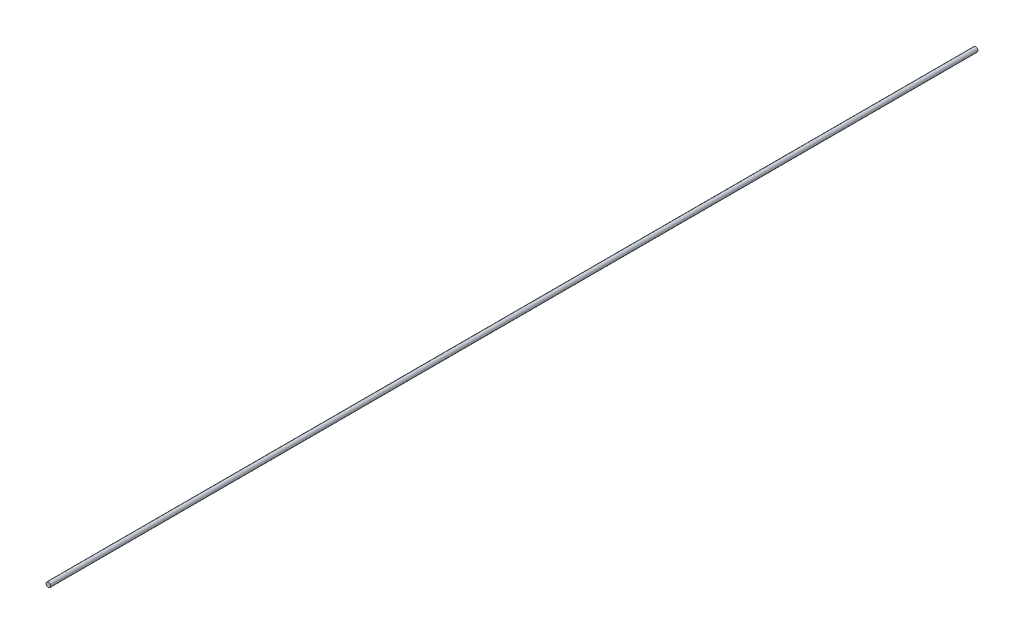
ISO-10303-21;
HEADER;
FILE_DESCRIPTION(('STEP AP214'),'2;1');
FILE_NAME('part.step','',(''),(''),'','','');
FILE_SCHEMA(('AUTOMOTIVE_DESIGN { 1 0 10303 214 1 1 1 1 }'));
ENDSEC;
DATA;
#1=APPLICATION_CONTEXT('core data for automotive mechanical design processes');
#2=APPLICATION_PROTOCOL_DEFINITION('international standard','automotive_design',2000,#1);
#3=PRODUCT_CONTEXT('',#1,'mechanical');
#4=PRODUCT('Part','Part','',(#3));
#5=PRODUCT_RELATED_PRODUCT_CATEGORY('part','',(#4));
#6=PRODUCT_DEFINITION_FORMATION('','',#4);
#7=PRODUCT_DEFINITION_CONTEXT('part definition',#1,'design');
#8=PRODUCT_DEFINITION('design','',#6,#7);
#9=PRODUCT_DEFINITION_SHAPE('','',#8);
#10=(LENGTH_UNIT() NAMED_UNIT(*) SI_UNIT(.MILLI.,.METRE.));
#11=(NAMED_UNIT(*) PLANE_ANGLE_UNIT() SI_UNIT($,.RADIAN.));
#12=(NAMED_UNIT(*) SI_UNIT($,.STERADIAN.) SOLID_ANGLE_UNIT());
#13=UNCERTAINTY_MEASURE_WITH_UNIT(LENGTH_MEASURE(1.E-05),#10,'distance_accuracy_value','');
#14=(GEOMETRIC_REPRESENTATION_CONTEXT(3) GLOBAL_UNCERTAINTY_ASSIGNED_CONTEXT((#13)) GLOBAL_UNIT_ASSIGNED_CONTEXT((#10,
#11,#12)) REPRESENTATION_CONTEXT('',''));
#15=CARTESIAN_POINT('',(0.,0.,0.));
#16=DIRECTION('',(0.,0.,1.));
#17=DIRECTION('',(1.,0.,0.));
#18=AXIS2_PLACEMENT_3D('',#15,#16,#17);
#19=CARTESIAN_POINT('',(0.,0.,1270.));
#20=DIRECTION('',(0.,0.,-1.));
#21=DIRECTION('',(-1.,0.,0.));
#22=AXIS2_PLACEMENT_3D('',#19,#20,#21);
#23=CYLINDRICAL_SURFACE('',#22,3.175);
#24=CARTESIAN_POINT('',(0.,0.,1270.));
#25=DIRECTION('',(0.,0.,1.));
#26=DIRECTION('',(1.,0.,0.));
#27=AXIS2_PLACEMENT_3D('',#24,#25,#26);
#28=CIRCLE('',#27,3.175);
#29=CARTESIAN_POINT('',(-3.175,0.,1270.));
#30=VERTEX_POINT('',#29);
#31=EDGE_CURVE('E10',#30,#30,#28,.T.);
#32=CARTESIAN_POINT('',(0.,0.,0.));
#33=DIRECTION('',(0.,0.,1.));
#34=DIRECTION('',(1.,0.,0.));
#35=AXIS2_PLACEMENT_3D('',#32,#33,#34);
#36=CIRCLE('',#35,3.175);
#37=CARTESIAN_POINT('',(-3.175,0.,-2.22044604925031E-13));
#38=VERTEX_POINT('',#37);
#39=EDGE_CURVE('E33',#38,#38,#36,.T.);
#40=CARTESIAN_POINT('',(-3.175,0.,1270.));
#41=CARTESIAN_POINT('',(-3.175,0.,1256.77083333333));
#42=CARTESIAN_POINT('',(-3.175,0.,1243.54166666667));
#43=CARTESIAN_POINT('',(-3.175,0.,1217.08333333333));
#44=CARTESIAN_POINT('',(-3.175,0.,1203.85416666667));
#45=CARTESIAN_POINT('',(-3.175,0.,1177.39583333333));
#46=CARTESIAN_POINT('',(-3.175,0.,1164.16666666667));
#47=CARTESIAN_POINT('',(-3.175,0.,1137.70833333333));
#48=CARTESIAN_POINT('',(-3.175,0.,1124.47916666667));
#49=CARTESIAN_POINT('',(-3.175,0.,1098.02083333333));
#50=CARTESIAN_POINT('',(-3.175,0.,1084.79166666667));
#51=CARTESIAN_POINT('',(-3.175,0.,1058.33333333333));
#52=CARTESIAN_POINT('',(-3.175,0.,1045.10416666667));
#53=CARTESIAN_POINT('',(-3.175,0.,1018.64583333333));
#54=CARTESIAN_POINT('',(-3.175,0.,1005.41666666667));
#55=CARTESIAN_POINT('',(-3.175,0.,978.958333333333));
#56=CARTESIAN_POINT('',(-3.175,0.,965.729166666667));
#57=CARTESIAN_POINT('',(-3.175,0.,939.270833333333));
#58=CARTESIAN_POINT('',(-3.175,0.,926.041666666667));
#59=CARTESIAN_POINT('',(-3.175,0.,899.583333333333));
#60=CARTESIAN_POINT('',(-3.175,0.,886.354166666666));
#61=CARTESIAN_POINT('',(-3.175,0.,859.895833333333));
#62=CARTESIAN_POINT('',(-3.175,0.,846.666666666666));
#63=CARTESIAN_POINT('',(-3.175,0.,820.208333333333));
#64=CARTESIAN_POINT('',(-3.175,0.,806.979166666667));
#65=CARTESIAN_POINT('',(-3.175,0.,780.520833333333));
#66=CARTESIAN_POINT('',(-3.175,0.,767.291666666667));
#67=CARTESIAN_POINT('',(-3.175,0.,740.833333333333));
#68=CARTESIAN_POINT('',(-3.175,0.,727.604166666667));
#69=CARTESIAN_POINT('',(-3.175,0.,701.145833333333));
#70=CARTESIAN_POINT('',(-3.175,0.,687.916666666666));
#71=CARTESIAN_POINT('',(-3.175,0.,661.458333333333));
#72=CARTESIAN_POINT('',(-3.175,0.,648.229166666666));
#73=CARTESIAN_POINT('',(-3.175,0.,621.770833333333));
#74=CARTESIAN_POINT('',(-3.175,0.,608.541666666666));
#75=CARTESIAN_POINT('',(-3.175,0.,582.083333333333));
#76=CARTESIAN_POINT('',(-3.175,0.,568.854166666666));
#77=CARTESIAN_POINT('',(-3.175,0.,542.395833333333));
#78=CARTESIAN_POINT('',(-3.175,0.,529.166666666666));
#79=CARTESIAN_POINT('',(-3.175,0.,502.708333333333));
#80=CARTESIAN_POINT('',(-3.175,0.,489.479166666666));
#81=CARTESIAN_POINT('',(-3.175,0.,463.020833333333));
#82=CARTESIAN_POINT('',(-3.175,0.,449.791666666666));
#83=CARTESIAN_POINT('',(-3.175,0.,423.333333333333));
#84=CARTESIAN_POINT('',(-3.175,0.,410.104166666666));
#85=CARTESIAN_POINT('',(-3.175,0.,383.645833333333));
#86=CARTESIAN_POINT('',(-3.175,0.,370.416666666666));
#87=CARTESIAN_POINT('',(-3.175,0.,343.958333333333));
#88=CARTESIAN_POINT('',(-3.175,0.,330.729166666666));
#89=CARTESIAN_POINT('',(-3.175,0.,304.270833333333));
#90=CARTESIAN_POINT('',(-3.175,0.,291.041666666666));
#91=CARTESIAN_POINT('',(-3.175,0.,264.583333333333));
#92=CARTESIAN_POINT('',(-3.175,0.,251.354166666666));
#93=CARTESIAN_POINT('',(-3.175,0.,224.895833333333));
#94=CARTESIAN_POINT('',(-3.175,0.,211.666666666667));
#95=CARTESIAN_POINT('',(-3.175,0.,185.208333333333));
#96=CARTESIAN_POINT('',(-3.175,0.,171.979166666666));
#97=CARTESIAN_POINT('',(-3.175,0.,145.520833333333));
#98=CARTESIAN_POINT('',(-3.175,0.,132.291666666666));
#99=CARTESIAN_POINT('',(-3.175,0.,105.833333333333));
#100=CARTESIAN_POINT('',(-3.175,0.,92.6041666666664));
#101=CARTESIAN_POINT('',(-3.175,0.,66.1458333333331));
#102=CARTESIAN_POINT('',(-3.175,0.,52.9166666666665));
#103=CARTESIAN_POINT('',(-3.175,0.,26.4583333333332));
#104=CARTESIAN_POINT('',(-3.175,0.,13.2291666666665));
#105=CARTESIAN_POINT('',(-3.175,0.,-2.22044604925031E-13));
#106=B_SPLINE_CURVE_WITH_KNOTS('',3,(#40,#41,#42,#43,#44,#45,#46,#47,#48,#49,#50,#51,#52,#53,
#54,#55,#56,#57,#58,#59,#60,#61,#62,#63,#64,#65,#66,#67,#68,#69,#70,#71,#72,#73,#74,#75,#76,#77,
#78,#79,#80,#81,#82,#83,#84,#85,#86,#87,#88,#89,#90,#91,#92,#93,#94,#95,#96,#97,#98,#99,#100,
#101,#102,#103,#104,#105),.UNSPECIFIED.,.F.,.F.,(4,2,2,2,2,2,2,2,2,2,2,2,2,2,2,2,2,2,2,2,2,2,2,
2,2,2,2,2,2,2,2,2,4),(0.,39.6875000000001,79.3750000000002,119.0625,158.75,198.4375,238.125,
277.8125,317.5,357.1875,396.875,436.5625,476.25,515.9375,555.625,595.3125,635.,674.6875,714.375,
754.0625,793.75,833.4375,873.125,912.8125,952.5,992.1875,1031.875,1071.5625,1111.25,1150.9375,
1190.625,1230.3125,1270.),.UNSPECIFIED.);
#107=EDGE_CURVE('BSEAM30',#30,#38,#106,.T.);
#108=ORIENTED_EDGE('',*,*,#31,.F.);
#109=ORIENTED_EDGE('',*,*,#39,.T.);
#110=ORIENTED_EDGE('',*,*,#107,.T.);
#111=ORIENTED_EDGE('',*,*,#107,.F.);
#112=EDGE_LOOP('',(#108,#110,#109,#111));
#113=FACE_BOUND('',#112,.T.);
#114=ADVANCED_FACE('F30',(#113),#23,.T.);
#115=CARTESIAN_POINT('',(0.,0.,1270.));
#116=DIRECTION('',(0.,0.,1.));
#117=DIRECTION('',(1.,0.,0.));
#118=AXIS2_PLACEMENT_3D('',#115,#116,#117);
#119=PLANE('',#118);
#120=ORIENTED_EDGE('',*,*,#31,.T.);
#121=EDGE_LOOP('',(#120));
#122=FACE_BOUND('',#121,.T.);
#123=ADVANCED_FACE('F45',(#122),#119,.T.);
#124=CARTESIAN_POINT('',(0.,0.,0.));
#125=DIRECTION('',(0.,0.,1.));
#126=DIRECTION('',(1.,0.,0.));
#127=AXIS2_PLACEMENT_3D('',#124,#125,#126);
#128=PLANE('',#127);
#129=ORIENTED_EDGE('',*,*,#39,.F.);
#130=EDGE_LOOP('',(#129));
#131=FACE_BOUND('',#130,.T.);
#132=ADVANCED_FACE('F43',(#131),#128,.F.);
#133=CLOSED_SHELL('',(#114,#123,#132));
#134=MANIFOLD_SOLID_BREP('B2',#133);
#135=ADVANCED_BREP_SHAPE_REPRESENTATION('',(#18,#134),#14);
#136=SHAPE_DEFINITION_REPRESENTATION(#9,#135);
ENDSEC;
END-ISO-10303-21;
